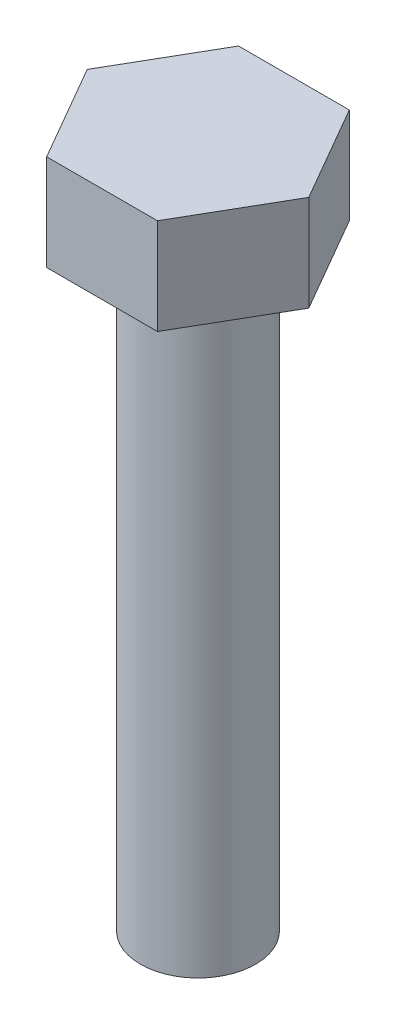
ISO-10303-21;
HEADER;
FILE_DESCRIPTION(('STEP AP214'),'2;1');
FILE_NAME('part.step','',(''),(''),'','','');
FILE_SCHEMA(('AUTOMOTIVE_DESIGN { 1 0 10303 214 1 1 1 1 }'));
ENDSEC;
DATA;
#1=APPLICATION_CONTEXT('core data for automotive mechanical design processes');
#2=APPLICATION_PROTOCOL_DEFINITION('international standard','automotive_design',2000,#1);
#3=PRODUCT_CONTEXT('',#1,'mechanical');
#4=PRODUCT('Part','Part','',(#3));
#5=PRODUCT_RELATED_PRODUCT_CATEGORY('part','',(#4));
#6=PRODUCT_DEFINITION_FORMATION('','',#4);
#7=PRODUCT_DEFINITION_CONTEXT('part definition',#1,'design');
#8=PRODUCT_DEFINITION('design','',#6,#7);
#9=PRODUCT_DEFINITION_SHAPE('','',#8);
#10=(LENGTH_UNIT() NAMED_UNIT(*) SI_UNIT(.MILLI.,.METRE.));
#11=(NAMED_UNIT(*) PLANE_ANGLE_UNIT() SI_UNIT($,.RADIAN.));
#12=(NAMED_UNIT(*) SI_UNIT($,.STERADIAN.) SOLID_ANGLE_UNIT());
#13=UNCERTAINTY_MEASURE_WITH_UNIT(LENGTH_MEASURE(1.E-05),#10,'distance_accuracy_value','');
#14=(GEOMETRIC_REPRESENTATION_CONTEXT(3) GLOBAL_UNCERTAINTY_ASSIGNED_CONTEXT((#13)) GLOBAL_UNIT_ASSIGNED_CONTEXT((#10,
#11,#12)) REPRESENTATION_CONTEXT('',''));
#15=CARTESIAN_POINT('',(0.,0.,0.));
#16=DIRECTION('',(0.,0.,1.));
#17=DIRECTION('',(1.,0.,0.));
#18=AXIS2_PLACEMENT_3D('',#15,#16,#17);
#19=CARTESIAN_POINT('',(0.,62.,0.));
#20=DIRECTION('',(0.,-1.,0.));
#21=DIRECTION('',(0.,0.,-1.));
#22=AXIS2_PLACEMENT_3D('',#19,#20,#21);
#23=CYLINDRICAL_SURFACE('',#22,6.);
#24=CARTESIAN_POINT('',(0.,62.,0.));
#25=DIRECTION('',(0.,1.,0.));
#26=DIRECTION('',(0.,0.,1.));
#27=AXIS2_PLACEMENT_3D('',#24,#25,#26);
#28=CIRCLE('',#27,6.);
#29=CARTESIAN_POINT('',(0.,62.,6.));
#30=VERTEX_POINT('',#29);
#31=EDGE_CURVE('E11',#30,#30,#28,.T.);
#32=ORIENTED_EDGE('',*,*,#31,.F.);
#33=EDGE_LOOP('',(#32));
#34=FACE_BOUND('',#33,.T.);
#35=CARTESIAN_POINT('',(0.,0.,0.));
#36=DIRECTION('',(0.,1.,0.));
#37=DIRECTION('',(0.,0.,1.));
#38=AXIS2_PLACEMENT_3D('',#35,#36,#37);
#39=CIRCLE('',#38,6.);
#40=CARTESIAN_POINT('',(0.,0.,6.));
#41=VERTEX_POINT('',#40);
#42=EDGE_CURVE('E48',#41,#41,#39,.T.);
#43=ORIENTED_EDGE('',*,*,#42,.T.);
#44=EDGE_LOOP('',(#43));
#45=FACE_BOUND('',#44,.T.);
#46=ADVANCED_FACE('F45',(#34,#45),#23,.T.);
#47=CARTESIAN_POINT('',(0.,0.,0.));
#48=DIRECTION('',(0.,1.,0.));
#49=DIRECTION('',(0.,0.,1.));
#50=AXIS2_PLACEMENT_3D('',#47,#48,#49);
#51=PLANE('',#50);
#52=ORIENTED_EDGE('',*,*,#42,.F.);
#53=EDGE_LOOP('',(#52));
#54=FACE_BOUND('',#53,.T.);
#55=ADVANCED_FACE('F170',(#54),#51,.F.);
#56=CARTESIAN_POINT('',(5.77350269189626,72.,10.));
#57=DIRECTION('',(-0.866025403784439,0.,-0.5));
#58=DIRECTION('',(-0.5,0.,0.866025403784439));
#59=AXIS2_PLACEMENT_3D('',#56,#57,#58);
#60=PLANE('',#59);
#61=DIRECTION('',(0.5,0.,-0.866025403784439));
#62=VECTOR('',#61,1.);
#63=CARTESIAN_POINT('',(5.77350269189626,62.,10.));
#64=LINE('',#63,#62);
#65=CARTESIAN_POINT('',(5.77350269189626,62.,10.));
#66=VERTEX_POINT('',#65);
#67=CARTESIAN_POINT('',(11.5470053837925,62.,0.));
#68=VERTEX_POINT('',#67);
#69=EDGE_CURVE('E135',#66,#68,#64,.T.);
#70=ORIENTED_EDGE('',*,*,#69,.T.);
#71=DIRECTION('',(0.,-1.,0.));
#72=VECTOR('',#71,1.);
#73=CARTESIAN_POINT('',(11.5470053837925,72.,0.));
#74=LINE('',#73,#72);
#75=CARTESIAN_POINT('',(11.5470053837925,72.,0.));
#76=VERTEX_POINT('',#75);
#77=EDGE_CURVE('E162',#76,#68,#74,.T.);
#78=ORIENTED_EDGE('',*,*,#77,.F.);
#79=DIRECTION('',(0.5,0.,-0.866025403784439));
#80=VECTOR('',#79,1.);
#81=CARTESIAN_POINT('',(5.77350269189626,72.,10.));
#82=LINE('',#81,#80);
#83=CARTESIAN_POINT('',(5.77350269189626,72.,10.));
#84=VERTEX_POINT('',#83);
#85=EDGE_CURVE('E151',#84,#76,#82,.T.);
#86=ORIENTED_EDGE('',*,*,#85,.F.);
#87=DIRECTION('',(0.,-1.,0.));
#88=VECTOR('',#87,1.);
#89=CARTESIAN_POINT('',(5.77350269189626,72.,10.));
#90=LINE('',#89,#88);
#91=EDGE_CURVE('E131',#84,#66,#90,.T.);
#92=ORIENTED_EDGE('',*,*,#91,.T.);
#93=EDGE_LOOP('',(#70,#78,#86,#92));
#94=FACE_BOUND('',#93,.T.);
#95=ADVANCED_FACE('F172',(#94),#60,.F.);
#96=CARTESIAN_POINT('',(11.5470053837925,72.,0.));
#97=DIRECTION('',(-0.866025403784438,0.,0.5));
#98=DIRECTION('',(0.5,0.,0.866025403784439));
#99=AXIS2_PLACEMENT_3D('',#96,#97,#98);
#100=PLANE('',#99);
#101=DIRECTION('',(-0.5,0.,-0.866025403784438));
#102=VECTOR('',#101,1.);
#103=CARTESIAN_POINT('',(11.5470053837925,62.,0.));
#104=LINE('',#103,#102);
#105=CARTESIAN_POINT('',(5.77350269189626,62.,-10.));
#106=VERTEX_POINT('',#105);
#107=EDGE_CURVE('E139',#68,#106,#104,.T.);
#108=ORIENTED_EDGE('',*,*,#107,.T.);
#109=DIRECTION('',(0.,-1.,0.));
#110=VECTOR('',#109,1.);
#111=CARTESIAN_POINT('',(5.77350269189626,72.,-10.));
#112=LINE('',#111,#110);
#113=CARTESIAN_POINT('',(5.77350269189626,72.,-10.));
#114=VERTEX_POINT('',#113);
#115=EDGE_CURVE('E158',#114,#106,#112,.T.);
#116=ORIENTED_EDGE('',*,*,#115,.F.);
#117=DIRECTION('',(-0.5,0.,-0.866025403784438));
#118=VECTOR('',#117,1.);
#119=CARTESIAN_POINT('',(11.5470053837925,72.,0.));
#120=LINE('',#119,#118);
#121=EDGE_CURVE('E100',#76,#114,#120,.T.);
#122=ORIENTED_EDGE('',*,*,#121,.F.);
#123=ORIENTED_EDGE('',*,*,#77,.T.);
#124=EDGE_LOOP('',(#108,#116,#122,#123));
#125=FACE_BOUND('',#124,.T.);
#126=ADVANCED_FACE('F177',(#125),#100,.F.);
#127=CARTESIAN_POINT('',(5.77350269189626,72.,-10.));
#128=DIRECTION('',(0.,0.,1.));
#129=DIRECTION('',(1.,0.,0.));
#130=AXIS2_PLACEMENT_3D('',#127,#128,#129);
#131=PLANE('',#130);
#132=DIRECTION('',(-1.,0.,0.));
#133=VECTOR('',#132,1.);
#134=CARTESIAN_POINT('',(5.77350269189626,62.,-10.));
#135=LINE('',#134,#133);
#136=CARTESIAN_POINT('',(-5.77350269189626,62.,-10.));
#137=VERTEX_POINT('',#136);
#138=EDGE_CURVE('E142',#106,#137,#135,.T.);
#139=ORIENTED_EDGE('',*,*,#138,.T.);
#140=DIRECTION('',(0.,-1.,0.));
#141=VECTOR('',#140,1.);
#142=CARTESIAN_POINT('',(-5.77350269189626,72.,-10.));
#143=LINE('',#142,#141);
#144=CARTESIAN_POINT('',(-5.77350269189626,72.,-10.));
#145=VERTEX_POINT('',#144);
#146=EDGE_CURVE('E124',#145,#137,#143,.T.);
#147=ORIENTED_EDGE('',*,*,#146,.F.);
#148=DIRECTION('',(-1.,0.,0.));
#149=VECTOR('',#148,1.);
#150=CARTESIAN_POINT('',(5.77350269189626,72.,-10.));
#151=LINE('',#150,#149);
#152=EDGE_CURVE('E113',#114,#145,#151,.T.);
#153=ORIENTED_EDGE('',*,*,#152,.F.);
#154=ORIENTED_EDGE('',*,*,#115,.T.);
#155=EDGE_LOOP('',(#139,#147,#153,#154));
#156=FACE_BOUND('',#155,.T.);
#157=ADVANCED_FACE('F184',(#156),#131,.F.);
#158=CARTESIAN_POINT('',(-5.77350269189626,72.,-10.));
#159=DIRECTION('',(0.866025403784439,0.,0.5));
#160=DIRECTION('',(0.5,0.,-0.866025403784439));
#161=AXIS2_PLACEMENT_3D('',#158,#159,#160);
#162=PLANE('',#161);
#163=DIRECTION('',(-0.5,0.,0.866025403784439));
#164=VECTOR('',#163,1.);
#165=CARTESIAN_POINT('',(-5.77350269189626,62.,-10.));
#166=LINE('',#165,#164);
#167=CARTESIAN_POINT('',(-11.5470053837925,62.,0.));
#168=VERTEX_POINT('',#167);
#169=EDGE_CURVE('E122',#137,#168,#166,.T.);
#170=ORIENTED_EDGE('',*,*,#169,.T.);
#171=DIRECTION('',(0.,-1.,0.));
#172=VECTOR('',#171,1.);
#173=CARTESIAN_POINT('',(-11.5470053837925,72.,0.));
#174=LINE('',#173,#172);
#175=CARTESIAN_POINT('',(-11.5470053837925,72.,0.));
#176=VERTEX_POINT('',#175);
#177=EDGE_CURVE('E119',#176,#168,#174,.T.);
#178=ORIENTED_EDGE('',*,*,#177,.F.);
#179=DIRECTION('',(-0.5,0.,0.866025403784439));
#180=VECTOR('',#179,1.);
#181=CARTESIAN_POINT('',(-5.77350269189626,72.,-10.));
#182=LINE('',#181,#180);
#183=EDGE_CURVE('E107',#145,#176,#182,.T.);
#184=ORIENTED_EDGE('',*,*,#183,.F.);
#185=ORIENTED_EDGE('',*,*,#146,.T.);
#186=EDGE_LOOP('',(#170,#178,#184,#185));
#187=FACE_BOUND('',#186,.T.);
#188=ADVANCED_FACE('F120',(#187),#162,.F.);
#189=CARTESIAN_POINT('',(-11.5470053837925,72.,0.));
#190=DIRECTION('',(0.866025403784438,0.,-0.5));
#191=DIRECTION('',(-0.5,0.,-0.866025403784438));
#192=AXIS2_PLACEMENT_3D('',#189,#190,#191);
#193=PLANE('',#192);
#194=DIRECTION('',(0.5,0.,0.866025403784438));
#195=VECTOR('',#194,1.);
#196=CARTESIAN_POINT('',(-11.5470053837925,62.,0.));
#197=LINE('',#196,#195);
#198=CARTESIAN_POINT('',(-5.77350269189626,62.,10.));
#199=VERTEX_POINT('',#198);
#200=EDGE_CURVE('E85',#168,#199,#197,.T.);
#201=ORIENTED_EDGE('',*,*,#200,.T.);
#202=DIRECTION('',(0.,-1.,0.));
#203=VECTOR('',#202,1.);
#204=CARTESIAN_POINT('',(-5.77350269189626,72.,10.));
#205=LINE('',#204,#203);
#206=CARTESIAN_POINT('',(-5.77350269189626,72.,10.));
#207=VERTEX_POINT('',#206);
#208=EDGE_CURVE('E125',#207,#199,#205,.T.);
#209=ORIENTED_EDGE('',*,*,#208,.F.);
#210=DIRECTION('',(0.5,0.,0.866025403784438));
#211=VECTOR('',#210,1.);
#212=CARTESIAN_POINT('',(-11.5470053837925,72.,0.));
#213=LINE('',#212,#211);
#214=EDGE_CURVE('E111',#176,#207,#213,.T.);
#215=ORIENTED_EDGE('',*,*,#214,.F.);
#216=ORIENTED_EDGE('',*,*,#177,.T.);
#217=EDGE_LOOP('',(#201,#209,#215,#216));
#218=FACE_BOUND('',#217,.T.);
#219=ADVANCED_FACE('F127',(#218),#193,.F.);
#220=CARTESIAN_POINT('',(-5.77350269189626,72.,10.));
#221=DIRECTION('',(0.,0.,-1.));
#222=DIRECTION('',(-1.,0.,0.));
#223=AXIS2_PLACEMENT_3D('',#220,#221,#222);
#224=PLANE('',#223);
#225=DIRECTION('',(1.,0.,0.));
#226=VECTOR('',#225,1.);
#227=CARTESIAN_POINT('',(-5.77350269189626,62.,10.));
#228=LINE('',#227,#226);
#229=EDGE_CURVE('E91',#199,#66,#228,.T.);
#230=ORIENTED_EDGE('',*,*,#229,.T.);
#231=ORIENTED_EDGE('',*,*,#91,.F.);
#232=DIRECTION('',(1.,0.,0.));
#233=VECTOR('',#232,1.);
#234=CARTESIAN_POINT('',(-5.77350269189626,72.,10.));
#235=LINE('',#234,#233);
#236=EDGE_CURVE('E62',#207,#84,#235,.T.);
#237=ORIENTED_EDGE('',*,*,#236,.F.);
#238=ORIENTED_EDGE('',*,*,#208,.T.);
#239=EDGE_LOOP('',(#230,#231,#237,#238));
#240=FACE_BOUND('',#239,.T.);
#241=ADVANCED_FACE('F192',(#240),#224,.F.);
#242=CARTESIAN_POINT('',(0.,72.,0.));
#243=DIRECTION('',(0.,1.,0.));
#244=DIRECTION('',(0.,0.,1.));
#245=AXIS2_PLACEMENT_3D('',#242,#243,#244);
#246=PLANE('',#245);
#247=ORIENTED_EDGE('',*,*,#85,.T.);
#248=ORIENTED_EDGE('',*,*,#121,.T.);
#249=ORIENTED_EDGE('',*,*,#152,.T.);
#250=ORIENTED_EDGE('',*,*,#183,.T.);
#251=ORIENTED_EDGE('',*,*,#214,.T.);
#252=ORIENTED_EDGE('',*,*,#236,.T.);
#253=EDGE_LOOP('',(#247,#248,#249,#250,#251,#252));
#254=FACE_BOUND('',#253,.T.);
#255=ADVANCED_FACE('F109',(#254),#246,.T.);
#256=CARTESIAN_POINT('',(0.,62.,0.));
#257=DIRECTION('',(0.,1.,0.));
#258=DIRECTION('',(0.,0.,1.));
#259=AXIS2_PLACEMENT_3D('',#256,#257,#258);
#260=PLANE('',#259);
#261=ORIENTED_EDGE('',*,*,#31,.T.);
#262=EDGE_LOOP('',(#261));
#263=FACE_BOUND('',#262,.T.);
#264=ORIENTED_EDGE('',*,*,#69,.F.);
#265=ORIENTED_EDGE('',*,*,#229,.F.);
#266=ORIENTED_EDGE('',*,*,#200,.F.);
#267=ORIENTED_EDGE('',*,*,#169,.F.);
#268=ORIENTED_EDGE('',*,*,#138,.F.);
#269=ORIENTED_EDGE('',*,*,#107,.F.);
#270=EDGE_LOOP('',(#264,#265,#266,#267,#268,#269));
#271=FACE_BOUND('',#270,.T.);
#272=ADVANCED_FACE('F195',(#263,#271),#260,.F.);
#273=CLOSED_SHELL('',(#46,#55,#95,#126,#157,#188,#219,#241,#255,#272));
#274=MANIFOLD_SOLID_BREP('B2',#273);
#275=ADVANCED_BREP_SHAPE_REPRESENTATION('',(#18,#274),#14);
#276=SHAPE_DEFINITION_REPRESENTATION(#9,#275);
ENDSEC;
END-ISO-10303-21;
